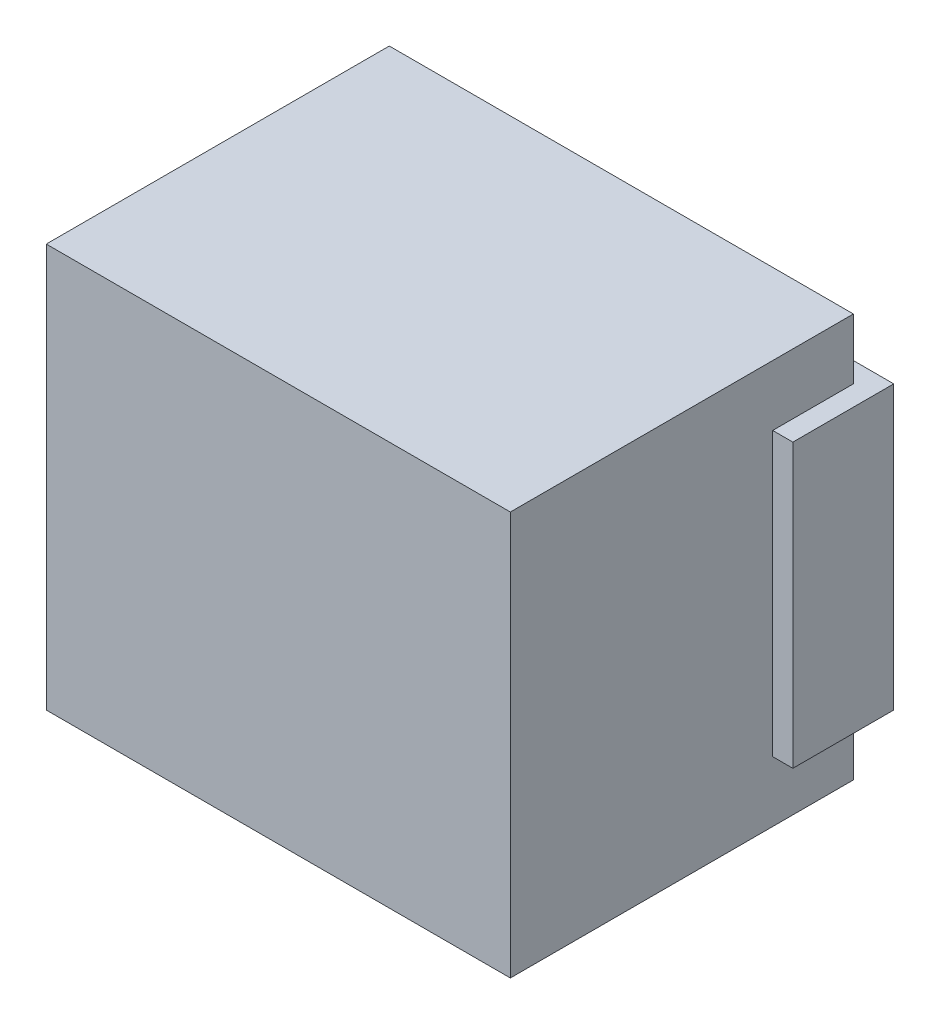
ISO-10303-21;
HEADER;
FILE_DESCRIPTION(('STEP AP214'),'2;1');
FILE_NAME('part.step','',(''),(''),'','','');
FILE_SCHEMA(('AUTOMOTIVE_DESIGN { 1 0 10303 214 1 1 1 1 }'));
ENDSEC;
DATA;
#1=APPLICATION_CONTEXT('core data for automotive mechanical design processes');
#2=APPLICATION_PROTOCOL_DEFINITION('international standard','automotive_design',2000,#1);
#3=PRODUCT_CONTEXT('',#1,'mechanical');
#4=PRODUCT('Part','Part','',(#3));
#5=PRODUCT_RELATED_PRODUCT_CATEGORY('part','',(#4));
#6=PRODUCT_DEFINITION_FORMATION('','',#4);
#7=PRODUCT_DEFINITION_CONTEXT('part definition',#1,'design');
#8=PRODUCT_DEFINITION('design','',#6,#7);
#9=PRODUCT_DEFINITION_SHAPE('','',#8);
#10=(LENGTH_UNIT() NAMED_UNIT(*) SI_UNIT(.MILLI.,.METRE.));
#11=(NAMED_UNIT(*) PLANE_ANGLE_UNIT() SI_UNIT($,.RADIAN.));
#12=(NAMED_UNIT(*) SI_UNIT($,.STERADIAN.) SOLID_ANGLE_UNIT());
#13=UNCERTAINTY_MEASURE_WITH_UNIT(LENGTH_MEASURE(1.E-05),#10,'distance_accuracy_value','');
#14=(GEOMETRIC_REPRESENTATION_CONTEXT(3) GLOBAL_UNCERTAINTY_ASSIGNED_CONTEXT((#13)) GLOBAL_UNIT_ASSIGNED_CONTEXT((#10,
#11,#12)) REPRESENTATION_CONTEXT('',''));
#15=CARTESIAN_POINT('',(0.,0.,0.));
#16=DIRECTION('',(0.,0.,1.));
#17=DIRECTION('',(1.,0.,0.));
#18=AXIS2_PLACEMENT_3D('',#15,#16,#17);
#19=CARTESIAN_POINT('',(1.15,1.,0.1));
#20=DIRECTION('',(0.,0.,1.));
#21=DIRECTION('',(1.,0.,0.));
#22=AXIS2_PLACEMENT_3D('',#19,#20,#21);
#23=PLANE('',#22);
#24=DIRECTION('',(1.,0.,0.));
#25=VECTOR('',#24,1.);
#26=CARTESIAN_POINT('',(0.85,0.7,0.1));
#27=LINE('',#26,#25);
#28=CARTESIAN_POINT('',(0.85,0.7,0.1));
#29=VERTEX_POINT('',#28);
#30=CARTESIAN_POINT('',(1.15,0.7,0.1));
#31=VERTEX_POINT('',#30);
#32=EDGE_CURVE('E147',#29,#31,#27,.T.);
#33=ORIENTED_EDGE('',*,*,#32,.F.);
#34=DIRECTION('',(0.,-1.,0.));
#35=VECTOR('',#34,1.);
#36=CARTESIAN_POINT('',(0.85,0.7,0.1));
#37=LINE('',#36,#35);
#38=CARTESIAN_POINT('',(0.85,-0.7,0.1));
#39=VERTEX_POINT('',#38);
#40=EDGE_CURVE('E391',#29,#39,#37,.T.);
#41=ORIENTED_EDGE('',*,*,#40,.T.);
#42=DIRECTION('',(1.,0.,0.));
#43=VECTOR('',#42,1.);
#44=CARTESIAN_POINT('',(0.85,-0.7,0.1));
#45=LINE('',#44,#43);
#46=CARTESIAN_POINT('',(1.15,-0.7,0.1));
#47=VERTEX_POINT('',#46);
#48=EDGE_CURVE('E387',#39,#47,#45,.T.);
#49=ORIENTED_EDGE('',*,*,#48,.T.);
#50=DIRECTION('',(0.,-1.,0.));
#51=VECTOR('',#50,1.);
#52=CARTESIAN_POINT('',(1.15,1.,0.1));
#53=LINE('',#52,#51);
#54=CARTESIAN_POINT('',(1.15,-1.,0.1));
#55=VERTEX_POINT('',#54);
#56=EDGE_CURVE('E175',#47,#55,#53,.T.);
#57=ORIENTED_EDGE('',*,*,#56,.T.);
#58=DIRECTION('',(-1.,0.,0.));
#59=VECTOR('',#58,1.);
#60=CARTESIAN_POINT('',(1.15,-1.,0.1));
#61=LINE('',#60,#59);
#62=CARTESIAN_POINT('',(-1.15,-1.,0.1));
#63=VERTEX_POINT('',#62);
#64=EDGE_CURVE('E202',#55,#63,#61,.T.);
#65=ORIENTED_EDGE('',*,*,#64,.T.);
#66=DIRECTION('',(0.,-1.,0.));
#67=VECTOR('',#66,1.);
#68=CARTESIAN_POINT('',(-1.15,1.,0.1));
#69=LINE('',#68,#67);
#70=CARTESIAN_POINT('',(-1.15,-0.7,0.1));
#71=VERTEX_POINT('',#70);
#72=EDGE_CURVE('E41',#71,#63,#69,.T.);
#73=ORIENTED_EDGE('',*,*,#72,.F.);
#74=DIRECTION('',(1.,0.,0.));
#75=VECTOR('',#74,1.);
#76=CARTESIAN_POINT('',(-0.85,-0.7,0.1));
#77=LINE('',#76,#75);
#78=CARTESIAN_POINT('',(-0.85,-0.7,0.1));
#79=VERTEX_POINT('',#78);
#80=EDGE_CURVE('E56',#71,#79,#77,.T.);
#81=ORIENTED_EDGE('',*,*,#80,.T.);
#82=DIRECTION('',(0.,-1.,0.));
#83=VECTOR('',#82,1.);
#84=CARTESIAN_POINT('',(-0.85,0.7,0.1));
#85=LINE('',#84,#83);
#86=CARTESIAN_POINT('',(-0.85,0.7,0.1));
#87=VERTEX_POINT('',#86);
#88=EDGE_CURVE('E208',#87,#79,#85,.T.);
#89=ORIENTED_EDGE('',*,*,#88,.F.);
#90=DIRECTION('',(1.,0.,0.));
#91=VECTOR('',#90,1.);
#92=CARTESIAN_POINT('',(-0.85,0.7,0.1));
#93=LINE('',#92,#91);
#94=CARTESIAN_POINT('',(-1.15,0.7,0.1));
#95=VERTEX_POINT('',#94);
#96=EDGE_CURVE('E410',#95,#87,#93,.T.);
#97=ORIENTED_EDGE('',*,*,#96,.F.);
#98=CARTESIAN_POINT('',(-1.15,1.,0.1));
#99=VERTEX_POINT('',#98);
#100=EDGE_CURVE('E11',#99,#95,#69,.T.);
#101=ORIENTED_EDGE('',*,*,#100,.F.);
#102=DIRECTION('',(-1.,0.,0.));
#103=VECTOR('',#102,1.);
#104=CARTESIAN_POINT('',(1.15,1.,0.1));
#105=LINE('',#104,#103);
#106=CARTESIAN_POINT('',(1.15,1.,0.1));
#107=VERTEX_POINT('',#106);
#108=EDGE_CURVE('E173',#107,#99,#105,.T.);
#109=ORIENTED_EDGE('',*,*,#108,.F.);
#110=EDGE_CURVE('E165',#107,#31,#53,.T.);
#111=ORIENTED_EDGE('',*,*,#110,.T.);
#112=EDGE_LOOP('',(#33,#41,#49,#57,#65,#73,#81,#89,#97,#101,#109,#111));
#113=FACE_BOUND('',#112,.T.);
#114=ADVANCED_FACE('F34',(#113),#23,.F.);
#115=CARTESIAN_POINT('',(1.15,1.,1.8));
#116=DIRECTION('',(-1.,0.,0.));
#117=DIRECTION('',(0.,0.,1.));
#118=AXIS2_PLACEMENT_3D('',#115,#116,#117);
#119=PLANE('',#118);
#120=DIRECTION('',(0.,0.,1.));
#121=VECTOR('',#120,1.);
#122=CARTESIAN_POINT('',(1.15,0.7,0.1));
#123=LINE('',#122,#121);
#124=CARTESIAN_POINT('',(1.15,0.7,0.5));
#125=VERTEX_POINT('',#124);
#126=EDGE_CURVE('E150',#31,#125,#123,.T.);
#127=ORIENTED_EDGE('',*,*,#126,.F.);
#128=ORIENTED_EDGE('',*,*,#110,.F.);
#129=DIRECTION('',(0.,0.,-1.));
#130=VECTOR('',#129,1.);
#131=CARTESIAN_POINT('',(1.15,1.,1.8));
#132=LINE('',#131,#130);
#133=CARTESIAN_POINT('',(1.15,1.,1.8));
#134=VERTEX_POINT('',#133);
#135=EDGE_CURVE('E180',#134,#107,#132,.T.);
#136=ORIENTED_EDGE('',*,*,#135,.F.);
#137=DIRECTION('',(0.,-1.,0.));
#138=VECTOR('',#137,1.);
#139=CARTESIAN_POINT('',(1.15,1.,1.8));
#140=LINE('',#139,#138);
#141=CARTESIAN_POINT('',(1.15,-1.,1.8));
#142=VERTEX_POINT('',#141);
#143=EDGE_CURVE('E174',#134,#142,#140,.T.);
#144=ORIENTED_EDGE('',*,*,#143,.T.);
#145=DIRECTION('',(0.,0.,-1.));
#146=VECTOR('',#145,1.);
#147=CARTESIAN_POINT('',(1.15,-1.,1.8));
#148=LINE('',#147,#146);
#149=EDGE_CURVE('E182',#142,#55,#148,.T.);
#150=ORIENTED_EDGE('',*,*,#149,.T.);
#151=ORIENTED_EDGE('',*,*,#56,.F.);
#152=DIRECTION('',(0.,0.,1.));
#153=VECTOR('',#152,1.);
#154=CARTESIAN_POINT('',(1.15,-0.7,0.1));
#155=LINE('',#154,#153);
#156=CARTESIAN_POINT('',(1.15,-0.7,0.5));
#157=VERTEX_POINT('',#156);
#158=EDGE_CURVE('E389',#47,#157,#155,.T.);
#159=ORIENTED_EDGE('',*,*,#158,.T.);
#160=DIRECTION('',(0.,-1.,0.));
#161=VECTOR('',#160,1.);
#162=CARTESIAN_POINT('',(1.15,0.7,0.5));
#163=LINE('',#162,#161);
#164=EDGE_CURVE('E168',#125,#157,#163,.T.);
#165=ORIENTED_EDGE('',*,*,#164,.F.);
#166=EDGE_LOOP('',(#127,#128,#136,#144,#150,#151,#159,#165));
#167=FACE_BOUND('',#166,.T.);
#168=ADVANCED_FACE('F163',(#167),#119,.F.);
#169=CARTESIAN_POINT('',(-1.15,1.,0.1));
#170=DIRECTION('',(1.,0.,0.));
#171=DIRECTION('',(0.,0.,-1.));
#172=AXIS2_PLACEMENT_3D('',#169,#170,#171);
#173=PLANE('',#172);
#174=DIRECTION('',(0.,0.,-1.));
#175=VECTOR('',#174,1.);
#176=CARTESIAN_POINT('',(-1.15,0.7,0.1));
#177=LINE('',#176,#175);
#178=CARTESIAN_POINT('',(-1.15,0.7,0.5));
#179=VERTEX_POINT('',#178);
#180=EDGE_CURVE('E408',#179,#95,#177,.T.);
#181=ORIENTED_EDGE('',*,*,#180,.F.);
#182=DIRECTION('',(0.,-1.,0.));
#183=VECTOR('',#182,1.);
#184=CARTESIAN_POINT('',(-1.15,0.7,0.5));
#185=LINE('',#184,#183);
#186=CARTESIAN_POINT('',(-1.15,-0.7,0.5));
#187=VERTEX_POINT('',#186);
#188=EDGE_CURVE('E421',#179,#187,#185,.T.);
#189=ORIENTED_EDGE('',*,*,#188,.T.);
#190=DIRECTION('',(0.,0.,-1.));
#191=VECTOR('',#190,1.);
#192=CARTESIAN_POINT('',(-1.15,-0.7,0.1));
#193=LINE('',#192,#191);
#194=EDGE_CURVE('E196',#187,#71,#193,.T.);
#195=ORIENTED_EDGE('',*,*,#194,.T.);
#196=ORIENTED_EDGE('',*,*,#72,.T.);
#197=DIRECTION('',(0.,0.,1.));
#198=VECTOR('',#197,1.);
#199=CARTESIAN_POINT('',(-1.15,-1.,0.1));
#200=LINE('',#199,#198);
#201=CARTESIAN_POINT('',(-1.15,-1.,1.8));
#202=VERTEX_POINT('',#201);
#203=EDGE_CURVE('E194',#63,#202,#200,.T.);
#204=ORIENTED_EDGE('',*,*,#203,.T.);
#205=DIRECTION('',(0.,-1.,0.));
#206=VECTOR('',#205,1.);
#207=CARTESIAN_POINT('',(-1.15,1.,1.8));
#208=LINE('',#207,#206);
#209=CARTESIAN_POINT('',(-1.15,1.,1.8));
#210=VERTEX_POINT('',#209);
#211=EDGE_CURVE('E178',#210,#202,#208,.T.);
#212=ORIENTED_EDGE('',*,*,#211,.F.);
#213=DIRECTION('',(0.,0.,1.));
#214=VECTOR('',#213,1.);
#215=CARTESIAN_POINT('',(-1.15,1.,0.1));
#216=LINE('',#215,#214);
#217=EDGE_CURVE('E215',#99,#210,#216,.T.);
#218=ORIENTED_EDGE('',*,*,#217,.F.);
#219=ORIENTED_EDGE('',*,*,#100,.T.);
#220=EDGE_LOOP('',(#181,#189,#195,#196,#204,#212,#218,#219));
#221=FACE_BOUND('',#220,.T.);
#222=ADVANCED_FACE('F193',(#221),#173,.F.);
#223=CARTESIAN_POINT('',(-1.15,1.,1.8));
#224=DIRECTION('',(0.,0.,-1.));
#225=DIRECTION('',(-1.,0.,0.));
#226=AXIS2_PLACEMENT_3D('',#223,#224,#225);
#227=PLANE('',#226);
#228=DIRECTION('',(1.,0.,0.));
#229=VECTOR('',#228,1.);
#230=CARTESIAN_POINT('',(-1.15,-1.,1.8));
#231=LINE('',#230,#229);
#232=EDGE_CURVE('E203',#202,#142,#231,.T.);
#233=ORIENTED_EDGE('',*,*,#232,.T.);
#234=ORIENTED_EDGE('',*,*,#143,.F.);
#235=DIRECTION('',(1.,0.,0.));
#236=VECTOR('',#235,1.);
#237=CARTESIAN_POINT('',(-1.15,1.,1.8));
#238=LINE('',#237,#236);
#239=EDGE_CURVE('E218',#210,#134,#238,.T.);
#240=ORIENTED_EDGE('',*,*,#239,.F.);
#241=ORIENTED_EDGE('',*,*,#211,.T.);
#242=EDGE_LOOP('',(#233,#234,#240,#241));
#243=FACE_BOUND('',#242,.T.);
#244=ADVANCED_FACE('F222',(#243),#227,.F.);
#245=CARTESIAN_POINT('',(-1.15,1.,0.1));
#246=DIRECTION('',(0.,1.,0.));
#247=DIRECTION('',(0.,0.,1.));
#248=AXIS2_PLACEMENT_3D('',#245,#246,#247);
#249=PLANE('',#248);
#250=ORIENTED_EDGE('',*,*,#108,.T.);
#251=ORIENTED_EDGE('',*,*,#217,.T.);
#252=ORIENTED_EDGE('',*,*,#239,.T.);
#253=ORIENTED_EDGE('',*,*,#135,.T.);
#254=EDGE_LOOP('',(#250,#251,#252,#253));
#255=FACE_BOUND('',#254,.T.);
#256=ADVANCED_FACE('F221',(#255),#249,.T.);
#257=CARTESIAN_POINT('',(-1.15,-1.,0.1));
#258=DIRECTION('',(0.,1.,0.));
#259=DIRECTION('',(0.,0.,1.));
#260=AXIS2_PLACEMENT_3D('',#257,#258,#259);
#261=PLANE('',#260);
#262=ORIENTED_EDGE('',*,*,#64,.F.);
#263=ORIENTED_EDGE('',*,*,#149,.F.);
#264=ORIENTED_EDGE('',*,*,#232,.F.);
#265=ORIENTED_EDGE('',*,*,#203,.F.);
#266=EDGE_LOOP('',(#262,#263,#264,#265));
#267=FACE_BOUND('',#266,.T.);
#268=ADVANCED_FACE('F200',(#267),#261,.F.);
#269=CARTESIAN_POINT('',(-0.85,0.7,0.));
#270=DIRECTION('',(-1.,0.,0.));
#271=DIRECTION('',(0.,0.,1.));
#272=AXIS2_PLACEMENT_3D('',#269,#270,#271);
#273=PLANE('',#272);
#274=DIRECTION('',(0.,0.,-1.));
#275=VECTOR('',#274,1.);
#276=CARTESIAN_POINT('',(-0.85,-0.7,0.));
#277=LINE('',#276,#275);
#278=CARTESIAN_POINT('',(-0.85,-0.7,0.));
#279=VERTEX_POINT('',#278);
#280=EDGE_CURVE('E424',#79,#279,#277,.T.);
#281=ORIENTED_EDGE('',*,*,#280,.T.);
#282=DIRECTION('',(0.,-1.,0.));
#283=VECTOR('',#282,1.);
#284=CARTESIAN_POINT('',(-0.85,0.7,0.));
#285=LINE('',#284,#283);
#286=CARTESIAN_POINT('',(-0.85,0.7,0.));
#287=VERTEX_POINT('',#286);
#288=EDGE_CURVE('E210',#287,#279,#285,.T.);
#289=ORIENTED_EDGE('',*,*,#288,.F.);
#290=DIRECTION('',(0.,0.,-1.));
#291=VECTOR('',#290,1.);
#292=CARTESIAN_POINT('',(-0.85,0.7,0.));
#293=LINE('',#292,#291);
#294=EDGE_CURVE('E413',#87,#287,#293,.T.);
#295=ORIENTED_EDGE('',*,*,#294,.F.);
#296=ORIENTED_EDGE('',*,*,#88,.T.);
#297=EDGE_LOOP('',(#281,#289,#295,#296));
#298=FACE_BOUND('',#297,.T.);
#299=ADVANCED_FACE('F239',(#298),#273,.F.);
#300=CARTESIAN_POINT('',(-1.25,0.7,0.));
#301=DIRECTION('',(0.,0.,1.));
#302=DIRECTION('',(1.,0.,0.));
#303=AXIS2_PLACEMENT_3D('',#300,#301,#302);
#304=PLANE('',#303);
#305=DIRECTION('',(-1.,0.,0.));
#306=VECTOR('',#305,1.);
#307=CARTESIAN_POINT('',(-1.25,-0.7,0.));
#308=LINE('',#307,#306);
#309=CARTESIAN_POINT('',(-1.25,-0.7,0.));
#310=VERTEX_POINT('',#309);
#311=EDGE_CURVE('E426',#279,#310,#308,.T.);
#312=ORIENTED_EDGE('',*,*,#311,.T.);
#313=DIRECTION('',(0.,-1.,0.));
#314=VECTOR('',#313,1.);
#315=CARTESIAN_POINT('',(-1.25,0.7,0.));
#316=LINE('',#315,#314);
#317=CARTESIAN_POINT('',(-1.25,0.7,0.));
#318=VERTEX_POINT('',#317);
#319=EDGE_CURVE('E435',#318,#310,#316,.T.);
#320=ORIENTED_EDGE('',*,*,#319,.F.);
#321=DIRECTION('',(-1.,0.,0.));
#322=VECTOR('',#321,1.);
#323=CARTESIAN_POINT('',(-1.25,0.7,0.));
#324=LINE('',#323,#322);
#325=EDGE_CURVE('E415',#287,#318,#324,.T.);
#326=ORIENTED_EDGE('',*,*,#325,.F.);
#327=ORIENTED_EDGE('',*,*,#288,.T.);
#328=EDGE_LOOP('',(#312,#320,#326,#327));
#329=FACE_BOUND('',#328,.T.);
#330=ADVANCED_FACE('F243',(#329),#304,.F.);
#331=CARTESIAN_POINT('',(-1.25,0.7,0.5));
#332=DIRECTION('',(1.,0.,0.));
#333=DIRECTION('',(0.,0.,-1.));
#334=AXIS2_PLACEMENT_3D('',#331,#332,#333);
#335=PLANE('',#334);
#336=DIRECTION('',(0.,0.,1.));
#337=VECTOR('',#336,1.);
#338=CARTESIAN_POINT('',(-1.25,-0.7,0.5));
#339=LINE('',#338,#337);
#340=CARTESIAN_POINT('',(-1.25,-0.7,0.5));
#341=VERTEX_POINT('',#340);
#342=EDGE_CURVE('E428',#310,#341,#339,.T.);
#343=ORIENTED_EDGE('',*,*,#342,.T.);
#344=DIRECTION('',(0.,-1.,0.));
#345=VECTOR('',#344,1.);
#346=CARTESIAN_POINT('',(-1.25,0.7,0.5));
#347=LINE('',#346,#345);
#348=CARTESIAN_POINT('',(-1.25,0.7,0.5));
#349=VERTEX_POINT('',#348);
#350=EDGE_CURVE('E432',#349,#341,#347,.T.);
#351=ORIENTED_EDGE('',*,*,#350,.F.);
#352=DIRECTION('',(0.,0.,1.));
#353=VECTOR('',#352,1.);
#354=CARTESIAN_POINT('',(-1.25,0.7,0.5));
#355=LINE('',#354,#353);
#356=EDGE_CURVE('E417',#318,#349,#355,.T.);
#357=ORIENTED_EDGE('',*,*,#356,.F.);
#358=ORIENTED_EDGE('',*,*,#319,.T.);
#359=EDGE_LOOP('',(#343,#351,#357,#358));
#360=FACE_BOUND('',#359,.T.);
#361=ADVANCED_FACE('F247',(#360),#335,.F.);
#362=CARTESIAN_POINT('',(-1.15,0.7,0.5));
#363=DIRECTION('',(0.,0.,-1.));
#364=DIRECTION('',(-1.,0.,0.));
#365=AXIS2_PLACEMENT_3D('',#362,#363,#364);
#366=PLANE('',#365);
#367=DIRECTION('',(1.,0.,0.));
#368=VECTOR('',#367,1.);
#369=CARTESIAN_POINT('',(-1.15,-0.7,0.5));
#370=LINE('',#369,#368);
#371=EDGE_CURVE('E411',#341,#187,#370,.T.);
#372=ORIENTED_EDGE('',*,*,#371,.T.);
#373=ORIENTED_EDGE('',*,*,#188,.F.);
#374=DIRECTION('',(1.,0.,0.));
#375=VECTOR('',#374,1.);
#376=CARTESIAN_POINT('',(-1.15,0.7,0.5));
#377=LINE('',#376,#375);
#378=EDGE_CURVE('E419',#349,#179,#377,.T.);
#379=ORIENTED_EDGE('',*,*,#378,.F.);
#380=ORIENTED_EDGE('',*,*,#350,.T.);
#381=EDGE_LOOP('',(#372,#373,#379,#380));
#382=FACE_BOUND('',#381,.T.);
#383=ADVANCED_FACE('F251',(#382),#366,.F.);
#384=CARTESIAN_POINT('',(-1.15,0.7,0.5));
#385=DIRECTION('',(0.,-1.,0.));
#386=DIRECTION('',(0.,0.,-1.));
#387=AXIS2_PLACEMENT_3D('',#384,#385,#386);
#388=PLANE('',#387);
#389=ORIENTED_EDGE('',*,*,#180,.T.);
#390=ORIENTED_EDGE('',*,*,#96,.T.);
#391=ORIENTED_EDGE('',*,*,#294,.T.);
#392=ORIENTED_EDGE('',*,*,#325,.T.);
#393=ORIENTED_EDGE('',*,*,#356,.T.);
#394=ORIENTED_EDGE('',*,*,#378,.T.);
#395=EDGE_LOOP('',(#389,#390,#391,#392,#393,#394));
#396=FACE_BOUND('',#395,.T.);
#397=ADVANCED_FACE('F255',(#396),#388,.F.);
#398=CARTESIAN_POINT('',(-1.15,-0.7,0.5));
#399=DIRECTION('',(0.,-1.,0.));
#400=DIRECTION('',(0.,0.,-1.));
#401=AXIS2_PLACEMENT_3D('',#398,#399,#400);
#402=PLANE('',#401);
#403=ORIENTED_EDGE('',*,*,#194,.F.);
#404=ORIENTED_EDGE('',*,*,#371,.F.);
#405=ORIENTED_EDGE('',*,*,#342,.F.);
#406=ORIENTED_EDGE('',*,*,#311,.F.);
#407=ORIENTED_EDGE('',*,*,#280,.F.);
#408=ORIENTED_EDGE('',*,*,#80,.F.);
#409=EDGE_LOOP('',(#403,#404,#405,#406,#407,#408));
#410=FACE_BOUND('',#409,.T.);
#411=ADVANCED_FACE('F257',(#410),#402,.T.);
#412=CARTESIAN_POINT('',(1.15,0.7,0.5));
#413=DIRECTION('',(0.,0.,-1.));
#414=DIRECTION('',(-1.,0.,0.));
#415=AXIS2_PLACEMENT_3D('',#412,#413,#414);
#416=PLANE('',#415);
#417=DIRECTION('',(1.,0.,0.));
#418=VECTOR('',#417,1.);
#419=CARTESIAN_POINT('',(1.15,-0.7,0.5));
#420=LINE('',#419,#418);
#421=CARTESIAN_POINT('',(1.25,-0.7,0.5));
#422=VERTEX_POINT('',#421);
#423=EDGE_CURVE('E48',#157,#422,#420,.T.);
#424=ORIENTED_EDGE('',*,*,#423,.T.);
#425=DIRECTION('',(0.,-1.,0.));
#426=VECTOR('',#425,1.);
#427=CARTESIAN_POINT('',(1.25,0.7,0.5));
#428=LINE('',#427,#426);
#429=CARTESIAN_POINT('',(1.25,0.7,0.5));
#430=VERTEX_POINT('',#429);
#431=EDGE_CURVE('E404',#430,#422,#428,.T.);
#432=ORIENTED_EDGE('',*,*,#431,.F.);
#433=DIRECTION('',(1.,0.,0.));
#434=VECTOR('',#433,1.);
#435=CARTESIAN_POINT('',(1.15,0.7,0.5));
#436=LINE('',#435,#434);
#437=EDGE_CURVE('E169',#125,#430,#436,.T.);
#438=ORIENTED_EDGE('',*,*,#437,.F.);
#439=ORIENTED_EDGE('',*,*,#164,.T.);
#440=EDGE_LOOP('',(#424,#432,#438,#439));
#441=FACE_BOUND('',#440,.T.);
#442=ADVANCED_FACE('F260',(#441),#416,.F.);
#443=CARTESIAN_POINT('',(1.25,0.7,0.5));
#444=DIRECTION('',(-1.,0.,0.));
#445=DIRECTION('',(0.,0.,1.));
#446=AXIS2_PLACEMENT_3D('',#443,#444,#445);
#447=PLANE('',#446);
#448=DIRECTION('',(0.,0.,-1.));
#449=VECTOR('',#448,1.);
#450=CARTESIAN_POINT('',(1.25,-0.7,0.5));
#451=LINE('',#450,#449);
#452=CARTESIAN_POINT('',(1.25,-0.7,0.));
#453=VERTEX_POINT('',#452);
#454=EDGE_CURVE('E453',#422,#453,#451,.T.);
#455=ORIENTED_EDGE('',*,*,#454,.T.);
#456=DIRECTION('',(0.,-1.,0.));
#457=VECTOR('',#456,1.);
#458=CARTESIAN_POINT('',(1.25,0.7,0.));
#459=LINE('',#458,#457);
#460=CARTESIAN_POINT('',(1.25,0.7,0.));
#461=VERTEX_POINT('',#460);
#462=EDGE_CURVE('E395',#461,#453,#459,.T.);
#463=ORIENTED_EDGE('',*,*,#462,.F.);
#464=DIRECTION('',(0.,0.,-1.));
#465=VECTOR('',#464,1.);
#466=CARTESIAN_POINT('',(1.25,0.7,0.5));
#467=LINE('',#466,#465);
#468=EDGE_CURVE('E460',#430,#461,#467,.T.);
#469=ORIENTED_EDGE('',*,*,#468,.F.);
#470=ORIENTED_EDGE('',*,*,#431,.T.);
#471=EDGE_LOOP('',(#455,#463,#469,#470));
#472=FACE_BOUND('',#471,.T.);
#473=ADVANCED_FACE('F266',(#472),#447,.F.);
#474=CARTESIAN_POINT('',(1.25,0.7,0.));
#475=DIRECTION('',(0.,0.,1.));
#476=DIRECTION('',(1.,0.,0.));
#477=AXIS2_PLACEMENT_3D('',#474,#475,#476);
#478=PLANE('',#477);
#479=DIRECTION('',(-1.,0.,0.));
#480=VECTOR('',#479,1.);
#481=CARTESIAN_POINT('',(1.25,-0.7,0.));
#482=LINE('',#481,#480);
#483=CARTESIAN_POINT('',(0.85,-0.7,0.));
#484=VERTEX_POINT('',#483);
#485=EDGE_CURVE('E456',#453,#484,#482,.T.);
#486=ORIENTED_EDGE('',*,*,#485,.T.);
#487=DIRECTION('',(0.,-1.,0.));
#488=VECTOR('',#487,1.);
#489=CARTESIAN_POINT('',(0.85,0.7,0.));
#490=LINE('',#489,#488);
#491=CARTESIAN_POINT('',(0.85,0.7,0.));
#492=VERTEX_POINT('',#491);
#493=EDGE_CURVE('E392',#492,#484,#490,.T.);
#494=ORIENTED_EDGE('',*,*,#493,.F.);
#495=DIRECTION('',(-1.,0.,0.));
#496=VECTOR('',#495,1.);
#497=CARTESIAN_POINT('',(1.25,0.7,0.));
#498=LINE('',#497,#496);
#499=EDGE_CURVE('E397',#461,#492,#498,.T.);
#500=ORIENTED_EDGE('',*,*,#499,.F.);
#501=ORIENTED_EDGE('',*,*,#462,.T.);
#502=EDGE_LOOP('',(#486,#494,#500,#501));
#503=FACE_BOUND('',#502,.T.);
#504=ADVANCED_FACE('F270',(#503),#478,.F.);
#505=CARTESIAN_POINT('',(0.85,0.7,0.));
#506=DIRECTION('',(1.,0.,0.));
#507=DIRECTION('',(0.,0.,-1.));
#508=AXIS2_PLACEMENT_3D('',#505,#506,#507);
#509=PLANE('',#508);
#510=DIRECTION('',(0.,0.,1.));
#511=VECTOR('',#510,1.);
#512=CARTESIAN_POINT('',(0.85,-0.7,0.));
#513=LINE('',#512,#511);
#514=EDGE_CURVE('E158',#484,#39,#513,.T.);
#515=ORIENTED_EDGE('',*,*,#514,.T.);
#516=ORIENTED_EDGE('',*,*,#40,.F.);
#517=DIRECTION('',(0.,0.,1.));
#518=VECTOR('',#517,1.);
#519=CARTESIAN_POINT('',(0.85,0.7,0.));
#520=LINE('',#519,#518);
#521=EDGE_CURVE('E153',#492,#29,#520,.T.);
#522=ORIENTED_EDGE('',*,*,#521,.F.);
#523=ORIENTED_EDGE('',*,*,#493,.T.);
#524=EDGE_LOOP('',(#515,#516,#522,#523));
#525=FACE_BOUND('',#524,.T.);
#526=ADVANCED_FACE('F274',(#525),#509,.F.);
#527=CARTESIAN_POINT('',(1.15,0.7,0.1));
#528=DIRECTION('',(0.,-1.,0.));
#529=DIRECTION('',(0.,0.,-1.));
#530=AXIS2_PLACEMENT_3D('',#527,#528,#529);
#531=PLANE('',#530);
#532=ORIENTED_EDGE('',*,*,#32,.T.);
#533=ORIENTED_EDGE('',*,*,#126,.T.);
#534=ORIENTED_EDGE('',*,*,#437,.T.);
#535=ORIENTED_EDGE('',*,*,#468,.T.);
#536=ORIENTED_EDGE('',*,*,#499,.T.);
#537=ORIENTED_EDGE('',*,*,#521,.T.);
#538=EDGE_LOOP('',(#532,#533,#534,#535,#536,#537));
#539=FACE_BOUND('',#538,.T.);
#540=ADVANCED_FACE('F149',(#539),#531,.F.);
#541=CARTESIAN_POINT('',(1.15,-0.7,0.1));
#542=DIRECTION('',(0.,-1.,0.));
#543=DIRECTION('',(0.,0.,-1.));
#544=AXIS2_PLACEMENT_3D('',#541,#542,#543);
#545=PLANE('',#544);
#546=ORIENTED_EDGE('',*,*,#48,.F.);
#547=ORIENTED_EDGE('',*,*,#514,.F.);
#548=ORIENTED_EDGE('',*,*,#485,.F.);
#549=ORIENTED_EDGE('',*,*,#454,.F.);
#550=ORIENTED_EDGE('',*,*,#423,.F.);
#551=ORIENTED_EDGE('',*,*,#158,.F.);
#552=EDGE_LOOP('',(#546,#547,#548,#549,#550,#551));
#553=FACE_BOUND('',#552,.T.);
#554=ADVANCED_FACE('F279',(#553),#545,.T.);
#555=CLOSED_SHELL('',(#114,#168,#222,#244,#256,#268,#299,#330,#361,#383,#397,#411,#442,#473,
#504,#526,#540,#554));
#556=MANIFOLD_SOLID_BREP('B2',#555);
#557=ADVANCED_BREP_SHAPE_REPRESENTATION('',(#18,#556),#14);
#558=SHAPE_DEFINITION_REPRESENTATION(#9,#557);
ENDSEC;
END-ISO-10303-21;
